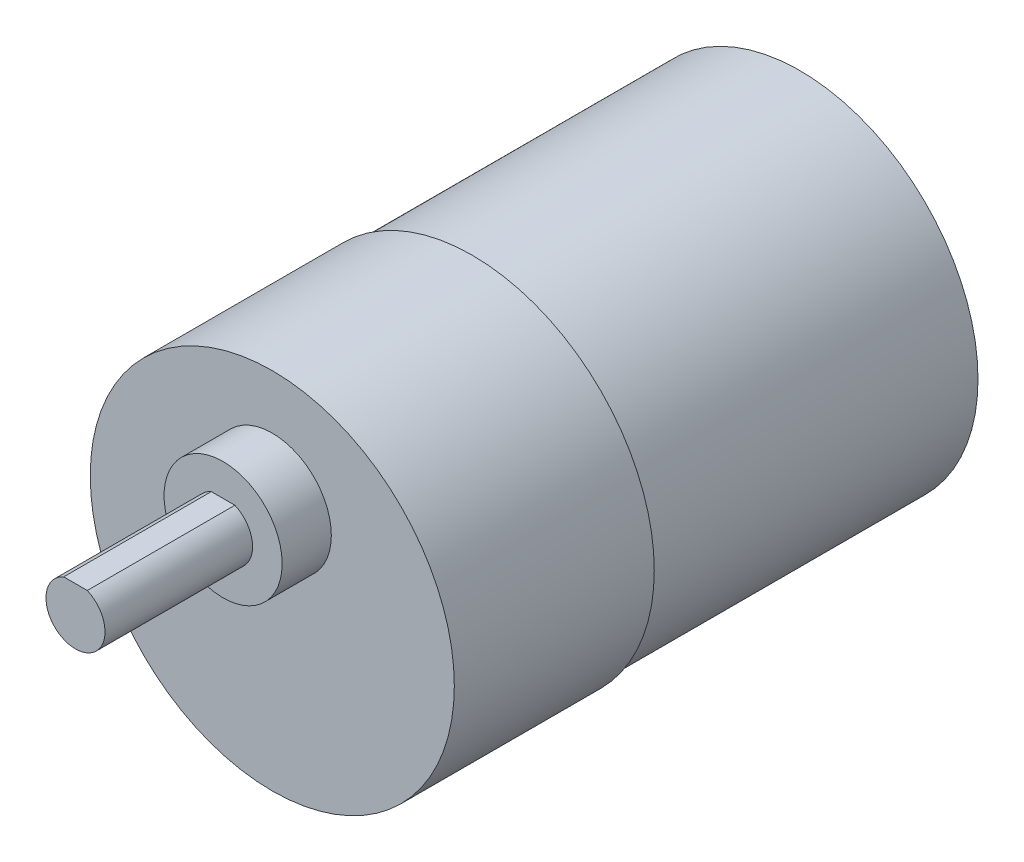
ISO-10303-21;
HEADER;
FILE_DESCRIPTION(('STEP AP214'),'2;1');
FILE_NAME('part.step','',(''),(''),'','','');
FILE_SCHEMA(('AUTOMOTIVE_DESIGN { 1 0 10303 214 1 1 1 1 }'));
ENDSEC;
DATA;
#1=APPLICATION_CONTEXT('core data for automotive mechanical design processes');
#2=APPLICATION_PROTOCOL_DEFINITION('international standard','automotive_design',2000,#1);
#3=PRODUCT_CONTEXT('',#1,'mechanical');
#4=PRODUCT('Part','Part','',(#3));
#5=PRODUCT_RELATED_PRODUCT_CATEGORY('part','',(#4));
#6=PRODUCT_DEFINITION_FORMATION('','',#4);
#7=PRODUCT_DEFINITION_CONTEXT('part definition',#1,'design');
#8=PRODUCT_DEFINITION('design','',#6,#7);
#9=PRODUCT_DEFINITION_SHAPE('','',#8);
#10=(LENGTH_UNIT() NAMED_UNIT(*) SI_UNIT(.MILLI.,.METRE.));
#11=(NAMED_UNIT(*) PLANE_ANGLE_UNIT() SI_UNIT($,.RADIAN.));
#12=(NAMED_UNIT(*) SI_UNIT($,.STERADIAN.) SOLID_ANGLE_UNIT());
#13=UNCERTAINTY_MEASURE_WITH_UNIT(LENGTH_MEASURE(1.E-05),#10,'distance_accuracy_value','');
#14=(GEOMETRIC_REPRESENTATION_CONTEXT(3) GLOBAL_UNCERTAINTY_ASSIGNED_CONTEXT((#13)) GLOBAL_UNIT_ASSIGNED_CONTEXT((#10,
#11,#12)) REPRESENTATION_CONTEXT('',''));
#15=CARTESIAN_POINT('',(0.,0.,0.));
#16=DIRECTION('',(0.,0.,1.));
#17=DIRECTION('',(1.,0.,0.));
#18=AXIS2_PLACEMENT_3D('',#15,#16,#17);
#19=CARTESIAN_POINT('',(0.,0.,16.65));
#20=DIRECTION('',(0.,0.,-1.));
#21=DIRECTION('',(-1.,0.,0.));
#22=AXIS2_PLACEMENT_3D('',#19,#20,#21);
#23=CYLINDRICAL_SURFACE('',#22,18.1);
#24=CARTESIAN_POINT('',(0.,0.,16.65));
#25=DIRECTION('',(0.,0.,1.));
#26=DIRECTION('',(1.,0.,0.));
#27=AXIS2_PLACEMENT_3D('',#24,#25,#26);
#28=CIRCLE('',#27,18.1);
#29=CARTESIAN_POINT('',(18.1,0.,16.65));
#30=VERTEX_POINT('',#29);
#31=EDGE_CURVE('E49',#30,#30,#28,.T.);
#32=ORIENTED_EDGE('',*,*,#31,.F.);
#33=EDGE_LOOP('',(#32));
#34=FACE_BOUND('',#33,.T.);
#35=CARTESIAN_POINT('',(0.,0.,-16.65));
#36=DIRECTION('',(0.,0.,1.));
#37=DIRECTION('',(1.,0.,0.));
#38=AXIS2_PLACEMENT_3D('',#35,#36,#37);
#39=CIRCLE('',#38,18.1);
#40=CARTESIAN_POINT('',(18.1,0.,-16.65));
#41=VERTEX_POINT('',#40);
#42=EDGE_CURVE('E44',#41,#41,#39,.T.);
#43=ORIENTED_EDGE('',*,*,#42,.T.);
#44=EDGE_LOOP('',(#43));
#45=FACE_BOUND('',#44,.T.);
#46=ADVANCED_FACE('F41',(#34,#45),#23,.T.);
#47=CARTESIAN_POINT('',(0.,0.,-16.65));
#48=DIRECTION('',(0.,0.,1.));
#49=DIRECTION('',(1.,0.,0.));
#50=AXIS2_PLACEMENT_3D('',#47,#48,#49);
#51=PLANE('',#50);
#52=ORIENTED_EDGE('',*,*,#42,.F.);
#53=EDGE_LOOP('',(#52));
#54=FACE_BOUND('',#53,.T.);
#55=ADVANCED_FACE('F102',(#54),#51,.F.);
#56=CARTESIAN_POINT('',(0.,0.,36.97));
#57=DIRECTION('',(0.,0.,-1.));
#58=DIRECTION('',(-1.,0.,0.));
#59=AXIS2_PLACEMENT_3D('',#56,#57,#58);
#60=CYLINDRICAL_SURFACE('',#59,18.5);
#61=CARTESIAN_POINT('',(0.,0.,36.97));
#62=DIRECTION('',(0.,0.,1.));
#63=DIRECTION('',(1.,0.,0.));
#64=AXIS2_PLACEMENT_3D('',#61,#62,#63);
#65=CIRCLE('',#64,18.5);
#66=CARTESIAN_POINT('',(18.5,0.,36.97));
#67=VERTEX_POINT('',#66);
#68=EDGE_CURVE('E91',#67,#67,#65,.T.);
#69=ORIENTED_EDGE('',*,*,#68,.F.);
#70=EDGE_LOOP('',(#69));
#71=FACE_BOUND('',#70,.T.);
#72=CARTESIAN_POINT('',(0.,0.,16.65));
#73=DIRECTION('',(0.,0.,1.));
#74=DIRECTION('',(1.,0.,0.));
#75=AXIS2_PLACEMENT_3D('',#72,#73,#74);
#76=CIRCLE('',#75,18.5);
#77=CARTESIAN_POINT('',(18.5,0.,16.65));
#78=VERTEX_POINT('',#77);
#79=EDGE_CURVE('E89',#78,#78,#76,.T.);
#80=ORIENTED_EDGE('',*,*,#79,.T.);
#81=EDGE_LOOP('',(#80));
#82=FACE_BOUND('',#81,.T.);
#83=ADVANCED_FACE('F104',(#71,#82),#60,.T.);
#84=CARTESIAN_POINT('',(0.,0.,36.97));
#85=DIRECTION('',(0.,0.,1.));
#86=DIRECTION('',(1.,0.,0.));
#87=AXIS2_PLACEMENT_3D('',#84,#85,#86);
#88=PLANE('',#87);
#89=CARTESIAN_POINT('',(0.,7.,36.97));
#90=DIRECTION('',(0.,0.,1.));
#91=DIRECTION('',(1.,0.,0.));
#92=AXIS2_PLACEMENT_3D('',#89,#90,#91);
#93=CIRCLE('',#92,5.999999938);
#94=CARTESIAN_POINT('',(5.999999938,7.,36.97));
#95=VERTEX_POINT('',#94);
#96=EDGE_CURVE('E80',#95,#95,#93,.T.);
#97=ORIENTED_EDGE('',*,*,#96,.F.);
#98=EDGE_LOOP('',(#97));
#99=FACE_BOUND('',#98,.T.);
#100=ORIENTED_EDGE('',*,*,#68,.T.);
#101=EDGE_LOOP('',(#100));
#102=FACE_BOUND('',#101,.T.);
#103=ADVANCED_FACE('F109',(#99,#102),#88,.T.);
#104=CARTESIAN_POINT('',(0.,0.,16.65));
#105=DIRECTION('',(0.,0.,1.));
#106=DIRECTION('',(1.,0.,0.));
#107=AXIS2_PLACEMENT_3D('',#104,#105,#106);
#108=PLANE('',#107);
#109=ORIENTED_EDGE('',*,*,#31,.T.);
#110=EDGE_LOOP('',(#109));
#111=FACE_BOUND('',#110,.T.);
#112=ORIENTED_EDGE('',*,*,#79,.F.);
#113=EDGE_LOOP('',(#112));
#114=FACE_BOUND('',#113,.T.);
#115=ADVANCED_FACE('F114',(#111,#114),#108,.F.);
#116=CARTESIAN_POINT('',(0.,7.,41.97));
#117=DIRECTION('',(0.,0.,-1.));
#118=DIRECTION('',(-1.,0.,0.));
#119=AXIS2_PLACEMENT_3D('',#116,#117,#118);
#120=CYLINDRICAL_SURFACE('',#119,5.999999938);
#121=CARTESIAN_POINT('',(0.,7.,41.97));
#122=DIRECTION('',(0.,0.,1.));
#123=DIRECTION('',(1.,0.,0.));
#124=AXIS2_PLACEMENT_3D('',#121,#122,#123);
#125=CIRCLE('',#124,5.999999938);
#126=CARTESIAN_POINT('',(5.999999938,7.,41.97));
#127=VERTEX_POINT('',#126);
#128=EDGE_CURVE('E83',#127,#127,#125,.T.);
#129=ORIENTED_EDGE('',*,*,#128,.F.);
#130=EDGE_LOOP('',(#129));
#131=FACE_BOUND('',#130,.T.);
#132=ORIENTED_EDGE('',*,*,#96,.T.);
#133=EDGE_LOOP('',(#132));
#134=FACE_BOUND('',#133,.T.);
#135=ADVANCED_FACE('F117',(#131,#134),#120,.T.);
#136=CARTESIAN_POINT('',(0.,7.,41.97));
#137=DIRECTION('',(0.,0.,1.));
#138=DIRECTION('',(1.,0.,0.));
#139=AXIS2_PLACEMENT_3D('',#136,#137,#138);
#140=PLANE('',#139);
#141=CARTESIAN_POINT('',(0.,7.,41.97));
#142=DIRECTION('',(0.,0.,1.));
#143=DIRECTION('',(1.,0.,0.));
#144=AXIS2_PLACEMENT_3D('',#141,#142,#143);
#145=CIRCLE('',#144,3.);
#146=CARTESIAN_POINT('',(-1.19895788082818,9.75,41.97));
#147=VERTEX_POINT('',#146);
#148=CARTESIAN_POINT('',(1.19895788082818,9.75,41.97));
#149=VERTEX_POINT('',#148);
#150=EDGE_CURVE('E11',#147,#149,#145,.T.);
#151=ORIENTED_EDGE('',*,*,#150,.F.);
#152=DIRECTION('',(-1.,0.,0.));
#153=VECTOR('',#152,1.);
#154=CARTESIAN_POINT('',(-1.19895788082818,9.75,41.97));
#155=LINE('',#154,#153);
#156=EDGE_CURVE('E62',#149,#147,#155,.T.);
#157=ORIENTED_EDGE('',*,*,#156,.F.);
#158=EDGE_LOOP('',(#151,#157));
#159=FACE_BOUND('',#158,.T.);
#160=ORIENTED_EDGE('',*,*,#128,.T.);
#161=EDGE_LOOP('',(#160));
#162=FACE_BOUND('',#161,.T.);
#163=ADVANCED_FACE('F123',(#159,#162),#140,.T.);
#164=CARTESIAN_POINT('',(0.,7.,56.97));
#165=DIRECTION('',(0.,0.,-1.));
#166=DIRECTION('',(-1.,0.,0.));
#167=AXIS2_PLACEMENT_3D('',#164,#165,#166);
#168=CYLINDRICAL_SURFACE('',#167,3.);
#169=CARTESIAN_POINT('',(0.,7.,56.97));
#170=DIRECTION('',(0.,0.,1.));
#171=DIRECTION('',(1.,0.,0.));
#172=AXIS2_PLACEMENT_3D('',#169,#170,#171);
#173=CIRCLE('',#172,3.);
#174=CARTESIAN_POINT('',(-1.19895788082818,9.75,56.97));
#175=VERTEX_POINT('',#174);
#176=CARTESIAN_POINT('',(1.19895788082818,9.75,56.97));
#177=VERTEX_POINT('',#176);
#178=EDGE_CURVE('E76',#175,#177,#173,.T.);
#179=ORIENTED_EDGE('',*,*,#178,.F.);
#180=DIRECTION('',(0.,0.,1.));
#181=VECTOR('',#180,1.);
#182=CARTESIAN_POINT('',(-1.19895788082818,9.75,38.9900466813218));
#183=LINE('',#182,#181);
#184=EDGE_CURVE('E57',#147,#175,#183,.T.);
#185=ORIENTED_EDGE('',*,*,#184,.F.);
#186=ORIENTED_EDGE('',*,*,#150,.T.);
#187=DIRECTION('',(0.,0.,1.));
#188=VECTOR('',#187,1.);
#189=CARTESIAN_POINT('',(1.19895788082818,9.75,38.9900466813218));
#190=LINE('',#189,#188);
#191=EDGE_CURVE('E69',#149,#177,#190,.T.);
#192=ORIENTED_EDGE('',*,*,#191,.T.);
#193=EDGE_LOOP('',(#179,#185,#186,#192));
#194=FACE_BOUND('',#193,.T.);
#195=ADVANCED_FACE('F75',(#194),#168,.T.);
#196=CARTESIAN_POINT('',(0.,7.,56.97));
#197=DIRECTION('',(0.,0.,1.));
#198=DIRECTION('',(1.,0.,0.));
#199=AXIS2_PLACEMENT_3D('',#196,#197,#198);
#200=PLANE('',#199);
#201=DIRECTION('',(1.,0.,0.));
#202=VECTOR('',#201,1.);
#203=CARTESIAN_POINT('',(-1.19895788082818,9.75,56.97));
#204=LINE('',#203,#202);
#205=EDGE_CURVE('E66',#175,#177,#204,.T.);
#206=ORIENTED_EDGE('',*,*,#205,.F.);
#207=ORIENTED_EDGE('',*,*,#178,.T.);
#208=EDGE_LOOP('',(#206,#207));
#209=FACE_BOUND('',#208,.T.);
#210=ADVANCED_FACE('F79',(#209),#200,.T.);
#211=CARTESIAN_POINT('',(-1.19895788082818,9.75,38.9900466813218));
#212=DIRECTION('',(0.,-1.,0.));
#213=DIRECTION('',(0.,0.,-1.));
#214=AXIS2_PLACEMENT_3D('',#211,#212,#213);
#215=PLANE('',#214);
#216=ORIENTED_EDGE('',*,*,#156,.T.);
#217=ORIENTED_EDGE('',*,*,#184,.T.);
#218=ORIENTED_EDGE('',*,*,#205,.T.);
#219=ORIENTED_EDGE('',*,*,#191,.F.);
#220=EDGE_LOOP('',(#216,#217,#218,#219));
#221=FACE_BOUND('',#220,.T.);
#222=ADVANCED_FACE('F68',(#221),#215,.F.);
#223=CLOSED_SHELL('',(#46,#55,#83,#103,#115,#135,#163,#195,#210,#222));
#224=MANIFOLD_SOLID_BREP('B2',#223);
#225=ADVANCED_BREP_SHAPE_REPRESENTATION('',(#18,#224),#14);
#226=SHAPE_DEFINITION_REPRESENTATION(#9,#225);
ENDSEC;
END-ISO-10303-21;
